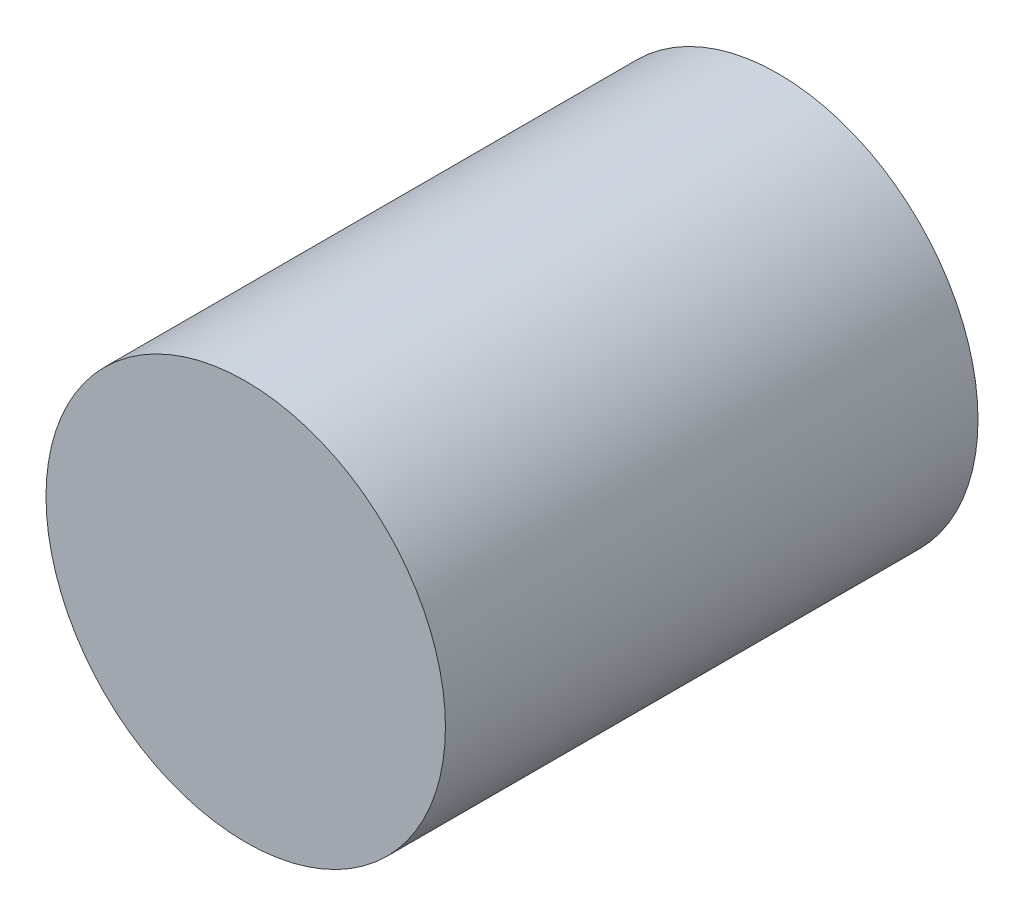
ISO-10303-21;
HEADER;
FILE_DESCRIPTION(('STEP AP214'),'2;1');
FILE_NAME('part.step','',(''),(''),'','','');
FILE_SCHEMA(('AUTOMOTIVE_DESIGN { 1 0 10303 214 1 1 1 1 }'));
ENDSEC;
DATA;
#1=APPLICATION_CONTEXT('core data for automotive mechanical design processes');
#2=APPLICATION_PROTOCOL_DEFINITION('international standard','automotive_design',2000,#1);
#3=PRODUCT_CONTEXT('',#1,'mechanical');
#4=PRODUCT('Part','Part','',(#3));
#5=PRODUCT_RELATED_PRODUCT_CATEGORY('part','',(#4));
#6=PRODUCT_DEFINITION_FORMATION('','',#4);
#7=PRODUCT_DEFINITION_CONTEXT('part definition',#1,'design');
#8=PRODUCT_DEFINITION('design','',#6,#7);
#9=PRODUCT_DEFINITION_SHAPE('','',#8);
#10=(LENGTH_UNIT() NAMED_UNIT(*) SI_UNIT(.MILLI.,.METRE.));
#11=(NAMED_UNIT(*) PLANE_ANGLE_UNIT() SI_UNIT($,.RADIAN.));
#12=(NAMED_UNIT(*) SI_UNIT($,.STERADIAN.) SOLID_ANGLE_UNIT());
#13=UNCERTAINTY_MEASURE_WITH_UNIT(LENGTH_MEASURE(1.E-05),#10,'distance_accuracy_value','');
#14=(GEOMETRIC_REPRESENTATION_CONTEXT(3) GLOBAL_UNCERTAINTY_ASSIGNED_CONTEXT((#13)) GLOBAL_UNIT_ASSIGNED_CONTEXT((#10,
#11,#12)) REPRESENTATION_CONTEXT('',''));
#15=CARTESIAN_POINT('',(0.,0.,0.));
#16=DIRECTION('',(0.,0.,1.));
#17=DIRECTION('',(1.,0.,0.));
#18=AXIS2_PLACEMENT_3D('',#15,#16,#17);
#19=CARTESIAN_POINT('',(0.,0.,20.));
#20=DIRECTION('',(0.,0.,-1.));
#21=DIRECTION('',(-1.,0.,0.));
#22=AXIS2_PLACEMENT_3D('',#19,#20,#21);
#23=CYLINDRICAL_SURFACE('',#22,7.5);
#24=CARTESIAN_POINT('',(0.,0.,20.));
#25=DIRECTION('',(0.,0.,1.));
#26=DIRECTION('',(1.,0.,0.));
#27=AXIS2_PLACEMENT_3D('',#24,#25,#26);
#28=CIRCLE('',#27,7.5);
#29=CARTESIAN_POINT('',(7.5,0.,20.));
#30=VERTEX_POINT('',#29);
#31=EDGE_CURVE('E10',#30,#30,#28,.T.);
#32=ORIENTED_EDGE('',*,*,#31,.F.);
#33=EDGE_LOOP('',(#32));
#34=FACE_BOUND('',#33,.T.);
#35=CARTESIAN_POINT('',(0.,0.,0.));
#36=DIRECTION('',(0.,0.,1.));
#37=DIRECTION('',(1.,0.,0.));
#38=AXIS2_PLACEMENT_3D('',#35,#36,#37);
#39=CIRCLE('',#38,7.5);
#40=CARTESIAN_POINT('',(7.5,0.,0.));
#41=VERTEX_POINT('',#40);
#42=EDGE_CURVE('E34',#41,#41,#39,.T.);
#43=ORIENTED_EDGE('',*,*,#42,.T.);
#44=EDGE_LOOP('',(#43));
#45=FACE_BOUND('',#44,.T.);
#46=ADVANCED_FACE('F31',(#34,#45),#23,.T.);
#47=CARTESIAN_POINT('',(0.,0.,20.));
#48=DIRECTION('',(0.,0.,1.));
#49=DIRECTION('',(1.,0.,0.));
#50=AXIS2_PLACEMENT_3D('',#47,#48,#49);
#51=PLANE('',#50);
#52=ORIENTED_EDGE('',*,*,#31,.T.);
#53=EDGE_LOOP('',(#52));
#54=FACE_BOUND('',#53,.T.);
#55=ADVANCED_FACE('F46',(#54),#51,.T.);
#56=CARTESIAN_POINT('',(0.,0.,0.));
#57=DIRECTION('',(0.,0.,1.));
#58=DIRECTION('',(1.,0.,0.));
#59=AXIS2_PLACEMENT_3D('',#56,#57,#58);
#60=PLANE('',#59);
#61=ORIENTED_EDGE('',*,*,#42,.F.);
#62=EDGE_LOOP('',(#61));
#63=FACE_BOUND('',#62,.T.);
#64=ADVANCED_FACE('F44',(#63),#60,.F.);
#65=CLOSED_SHELL('',(#46,#55,#64));
#66=MANIFOLD_SOLID_BREP('B2',#65);
#67=ADVANCED_BREP_SHAPE_REPRESENTATION('',(#18,#66),#14);
#68=SHAPE_DEFINITION_REPRESENTATION(#9,#67);
ENDSEC;
END-ISO-10303-21;
